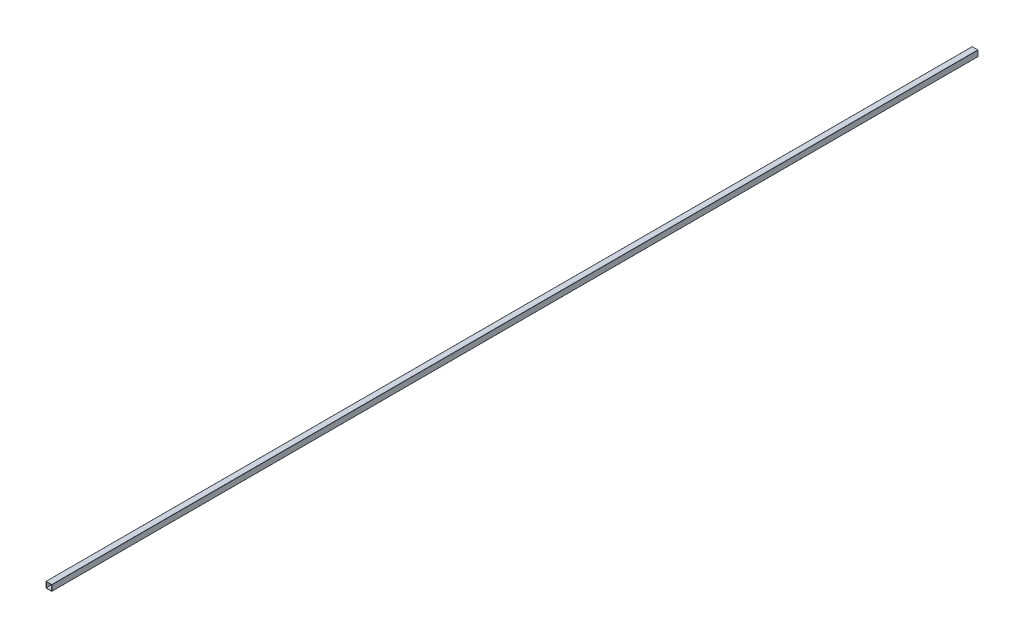
ISO-10303-21;
HEADER;
FILE_DESCRIPTION(('STEP AP214'),'2;1');
FILE_NAME('part.step','',(''),(''),'','','');
FILE_SCHEMA(('AUTOMOTIVE_DESIGN { 1 0 10303 214 1 1 1 1 }'));
ENDSEC;
DATA;
#1=APPLICATION_CONTEXT('core data for automotive mechanical design processes');
#2=APPLICATION_PROTOCOL_DEFINITION('international standard','automotive_design',2000,#1);
#3=PRODUCT_CONTEXT('',#1,'mechanical');
#4=PRODUCT('Part','Part','',(#3));
#5=PRODUCT_RELATED_PRODUCT_CATEGORY('part','',(#4));
#6=PRODUCT_DEFINITION_FORMATION('','',#4);
#7=PRODUCT_DEFINITION_CONTEXT('part definition',#1,'design');
#8=PRODUCT_DEFINITION('design','',#6,#7);
#9=PRODUCT_DEFINITION_SHAPE('','',#8);
#10=(LENGTH_UNIT() NAMED_UNIT(*) SI_UNIT(.MILLI.,.METRE.));
#11=(NAMED_UNIT(*) PLANE_ANGLE_UNIT() SI_UNIT($,.RADIAN.));
#12=(NAMED_UNIT(*) SI_UNIT($,.STERADIAN.) SOLID_ANGLE_UNIT());
#13=UNCERTAINTY_MEASURE_WITH_UNIT(LENGTH_MEASURE(1.E-05),#10,'distance_accuracy_value','');
#14=(GEOMETRIC_REPRESENTATION_CONTEXT(3) GLOBAL_UNCERTAINTY_ASSIGNED_CONTEXT((#13)) GLOBAL_UNIT_ASSIGNED_CONTEXT((#10,
#11,#12)) REPRESENTATION_CONTEXT('',''));
#15=CARTESIAN_POINT('',(0.,0.,0.));
#16=DIRECTION('',(0.,0.,1.));
#17=DIRECTION('',(1.,0.,0.));
#18=AXIS2_PLACEMENT_3D('',#15,#16,#17);
#19=CARTESIAN_POINT('',(18.05,18.05,6000.));
#20=DIRECTION('',(0.,0.,-1.));
#21=DIRECTION('',(-1.,0.,0.));
#22=AXIS2_PLACEMENT_3D('',#19,#20,#21);
#23=PLANE('',#22);
#24=CARTESIAN_POINT('',(18.05,18.05,6000.));
#25=DIRECTION('',(0.,0.,1.));
#26=DIRECTION('',(-1.,0.,0.));
#27=AXIS2_PLACEMENT_3D('',#24,#25,#26);
#28=CIRCLE('',#27,1.);
#29=CARTESIAN_POINT('',(19.05,18.05,6000.));
#30=VERTEX_POINT('',#29);
#31=CARTESIAN_POINT('',(18.05,19.05,6000.));
#32=VERTEX_POINT('',#31);
#33=EDGE_CURVE('E158',#30,#32,#28,.T.);
#34=ORIENTED_EDGE('',*,*,#33,.T.);
#35=DIRECTION('',(-1.,0.,0.));
#36=VECTOR('',#35,1.);
#37=CARTESIAN_POINT('',(-18.05,19.05,6000.));
#38=LINE('',#37,#36);
#39=CARTESIAN_POINT('',(-18.05,19.05,6000.));
#40=VERTEX_POINT('',#39);
#41=EDGE_CURVE('E161',#32,#40,#38,.T.);
#42=ORIENTED_EDGE('',*,*,#41,.T.);
#43=CARTESIAN_POINT('',(-18.05,18.05,6000.));
#44=DIRECTION('',(0.,0.,1.));
#45=DIRECTION('',(-1.,0.,0.));
#46=AXIS2_PLACEMENT_3D('',#43,#44,#45);
#47=CIRCLE('',#46,1.);
#48=CARTESIAN_POINT('',(-19.05,18.05,6000.));
#49=VERTEX_POINT('',#48);
#50=EDGE_CURVE('E164',#40,#49,#47,.T.);
#51=ORIENTED_EDGE('',*,*,#50,.T.);
#52=DIRECTION('',(0.,-1.,0.));
#53=VECTOR('',#52,1.);
#54=CARTESIAN_POINT('',(-19.05,-18.05,6000.));
#55=LINE('',#54,#53);
#56=CARTESIAN_POINT('',(-19.05,-18.05,6000.));
#57=VERTEX_POINT('',#56);
#58=EDGE_CURVE('E166',#49,#57,#55,.T.);
#59=ORIENTED_EDGE('',*,*,#58,.T.);
#60=CARTESIAN_POINT('',(-18.05,-18.05,6000.));
#61=DIRECTION('',(0.,0.,1.));
#62=DIRECTION('',(-1.,0.,0.));
#63=AXIS2_PLACEMENT_3D('',#60,#61,#62);
#64=CIRCLE('',#63,1.);
#65=CARTESIAN_POINT('',(-18.05,-19.05,6000.));
#66=VERTEX_POINT('',#65);
#67=EDGE_CURVE('E168',#57,#66,#64,.T.);
#68=ORIENTED_EDGE('',*,*,#67,.T.);
#69=DIRECTION('',(1.,0.,0.));
#70=VECTOR('',#69,1.);
#71=CARTESIAN_POINT('',(-18.05,-19.05,6000.));
#72=LINE('',#71,#70);
#73=CARTESIAN_POINT('',(18.05,-19.05,6000.));
#74=VERTEX_POINT('',#73);
#75=EDGE_CURVE('E170',#66,#74,#72,.T.);
#76=ORIENTED_EDGE('',*,*,#75,.T.);
#77=CARTESIAN_POINT('',(18.05,-18.05,6000.));
#78=DIRECTION('',(0.,0.,1.));
#79=DIRECTION('',(1.,0.,0.));
#80=AXIS2_PLACEMENT_3D('',#77,#78,#79);
#81=CIRCLE('',#80,1.);
#82=CARTESIAN_POINT('',(19.05,-18.05,6000.));
#83=VERTEX_POINT('',#82);
#84=EDGE_CURVE('E172',#74,#83,#81,.T.);
#85=ORIENTED_EDGE('',*,*,#84,.T.);
#86=DIRECTION('',(0.,1.,0.));
#87=VECTOR('',#86,1.);
#88=CARTESIAN_POINT('',(19.05,-18.05,6000.));
#89=LINE('',#88,#87);
#90=EDGE_CURVE('E174',#83,#30,#89,.T.);
#91=ORIENTED_EDGE('',*,*,#90,.T.);
#92=EDGE_LOOP('',(#34,#42,#51,#59,#68,#76,#85,#91));
#93=FACE_BOUND('',#92,.T.);
#94=DIRECTION('',(1.,0.,0.));
#95=VECTOR('',#94,1.);
#96=CARTESIAN_POINT('',(-17.16,-17.16,6000.));
#97=LINE('',#96,#95);
#98=CARTESIAN_POINT('',(-17.16,-17.16,6000.));
#99=VERTEX_POINT('',#98);
#100=CARTESIAN_POINT('',(17.16,-17.16,6000.));
#101=VERTEX_POINT('',#100);
#102=EDGE_CURVE('E122',#99,#101,#97,.T.);
#103=ORIENTED_EDGE('',*,*,#102,.F.);
#104=DIRECTION('',(0.,-1.,0.));
#105=VECTOR('',#104,1.);
#106=CARTESIAN_POINT('',(-17.16,-17.16,6000.));
#107=LINE('',#106,#105);
#108=CARTESIAN_POINT('',(-17.16,17.16,6000.));
#109=VERTEX_POINT('',#108);
#110=EDGE_CURVE('E144',#109,#99,#107,.T.);
#111=ORIENTED_EDGE('',*,*,#110,.F.);
#112=DIRECTION('',(-1.,0.,0.));
#113=VECTOR('',#112,1.);
#114=CARTESIAN_POINT('',(-17.16,17.16,6000.));
#115=LINE('',#114,#113);
#116=CARTESIAN_POINT('',(17.16,17.16,6000.));
#117=VERTEX_POINT('',#116);
#118=EDGE_CURVE('E142',#117,#109,#115,.T.);
#119=ORIENTED_EDGE('',*,*,#118,.F.);
#120=DIRECTION('',(0.,1.,0.));
#121=VECTOR('',#120,1.);
#122=CARTESIAN_POINT('',(17.16,-17.16,6000.));
#123=LINE('',#122,#121);
#124=EDGE_CURVE('E130',#101,#117,#123,.T.);
#125=ORIENTED_EDGE('',*,*,#124,.F.);
#126=EDGE_LOOP('',(#103,#111,#119,#125));
#127=FACE_BOUND('',#126,.T.);
#128=ADVANCED_FACE('F33',(#93,#127),#23,.F.);
#129=CARTESIAN_POINT('',(18.05,18.05,0.));
#130=DIRECTION('',(0.,0.,-1.));
#131=DIRECTION('',(-1.,0.,0.));
#132=AXIS2_PLACEMENT_3D('',#129,#130,#131);
#133=PLANE('',#132);
#134=CARTESIAN_POINT('',(18.05,18.05,0.));
#135=DIRECTION('',(0.,0.,1.));
#136=DIRECTION('',(-1.,0.,0.));
#137=AXIS2_PLACEMENT_3D('',#134,#135,#136);
#138=CIRCLE('',#137,1.);
#139=CARTESIAN_POINT('',(19.05,18.05,0.));
#140=VERTEX_POINT('',#139);
#141=CARTESIAN_POINT('',(18.05,19.05,0.));
#142=VERTEX_POINT('',#141);
#143=EDGE_CURVE('E138',#140,#142,#138,.T.);
#144=ORIENTED_EDGE('',*,*,#143,.F.);
#145=DIRECTION('',(0.,1.,0.));
#146=VECTOR('',#145,1.);
#147=CARTESIAN_POINT('',(19.05,-18.05,0.));
#148=LINE('',#147,#146);
#149=CARTESIAN_POINT('',(19.05,-18.05,0.));
#150=VERTEX_POINT('',#149);
#151=EDGE_CURVE('E162',#150,#140,#148,.T.);
#152=ORIENTED_EDGE('',*,*,#151,.F.);
#153=CARTESIAN_POINT('',(18.05,-18.05,0.));
#154=DIRECTION('',(0.,0.,1.));
#155=DIRECTION('',(1.,0.,0.));
#156=AXIS2_PLACEMENT_3D('',#153,#154,#155);
#157=CIRCLE('',#156,1.);
#158=CARTESIAN_POINT('',(18.05,-19.05,0.));
#159=VERTEX_POINT('',#158);
#160=EDGE_CURVE('E189',#159,#150,#157,.T.);
#161=ORIENTED_EDGE('',*,*,#160,.F.);
#162=DIRECTION('',(1.,0.,0.));
#163=VECTOR('',#162,1.);
#164=CARTESIAN_POINT('',(-18.05,-19.05,0.));
#165=LINE('',#164,#163);
#166=CARTESIAN_POINT('',(-18.05,-19.05,0.));
#167=VERTEX_POINT('',#166);
#168=EDGE_CURVE('E187',#167,#159,#165,.T.);
#169=ORIENTED_EDGE('',*,*,#168,.F.);
#170=CARTESIAN_POINT('',(-18.05,-18.05,0.));
#171=DIRECTION('',(0.,0.,1.));
#172=DIRECTION('',(-1.,0.,0.));
#173=AXIS2_PLACEMENT_3D('',#170,#171,#172);
#174=CIRCLE('',#173,1.);
#175=CARTESIAN_POINT('',(-19.05,-18.05,0.));
#176=VERTEX_POINT('',#175);
#177=EDGE_CURVE('E185',#176,#167,#174,.T.);
#178=ORIENTED_EDGE('',*,*,#177,.F.);
#179=DIRECTION('',(0.,-1.,0.));
#180=VECTOR('',#179,1.);
#181=CARTESIAN_POINT('',(-19.05,-18.05,0.));
#182=LINE('',#181,#180);
#183=CARTESIAN_POINT('',(-19.05,18.05,0.));
#184=VERTEX_POINT('',#183);
#185=EDGE_CURVE('E183',#184,#176,#182,.T.);
#186=ORIENTED_EDGE('',*,*,#185,.F.);
#187=CARTESIAN_POINT('',(-18.05,18.05,0.));
#188=DIRECTION('',(0.,0.,1.));
#189=DIRECTION('',(-1.,0.,0.));
#190=AXIS2_PLACEMENT_3D('',#187,#188,#189);
#191=CIRCLE('',#190,1.);
#192=CARTESIAN_POINT('',(-18.05,19.05,0.));
#193=VERTEX_POINT('',#192);
#194=EDGE_CURVE('E181',#193,#184,#191,.T.);
#195=ORIENTED_EDGE('',*,*,#194,.F.);
#196=DIRECTION('',(-1.,0.,0.));
#197=VECTOR('',#196,1.);
#198=CARTESIAN_POINT('',(-18.05,19.05,0.));
#199=LINE('',#198,#197);
#200=EDGE_CURVE('E179',#142,#193,#199,.T.);
#201=ORIENTED_EDGE('',*,*,#200,.F.);
#202=EDGE_LOOP('',(#144,#152,#161,#169,#178,#186,#195,#201));
#203=FACE_BOUND('',#202,.T.);
#204=DIRECTION('',(0.,-1.,0.));
#205=VECTOR('',#204,1.);
#206=CARTESIAN_POINT('',(-17.16,-17.16,0.));
#207=LINE('',#206,#205);
#208=CARTESIAN_POINT('',(-17.16,17.16,0.));
#209=VERTEX_POINT('',#208);
#210=CARTESIAN_POINT('',(-17.16,-17.16,0.));
#211=VERTEX_POINT('',#210);
#212=EDGE_CURVE('E131',#209,#211,#207,.T.);
#213=ORIENTED_EDGE('',*,*,#212,.T.);
#214=DIRECTION('',(1.,0.,0.));
#215=VECTOR('',#214,1.);
#216=CARTESIAN_POINT('',(-17.16,-17.16,0.));
#217=LINE('',#216,#215);
#218=CARTESIAN_POINT('',(17.16,-17.16,0.));
#219=VERTEX_POINT('',#218);
#220=EDGE_CURVE('E56',#211,#219,#217,.T.);
#221=ORIENTED_EDGE('',*,*,#220,.T.);
#222=DIRECTION('',(0.,1.,0.));
#223=VECTOR('',#222,1.);
#224=CARTESIAN_POINT('',(17.16,-17.16,0.));
#225=LINE('',#224,#223);
#226=CARTESIAN_POINT('',(17.16,17.16,0.));
#227=VERTEX_POINT('',#226);
#228=EDGE_CURVE('E137',#219,#227,#225,.T.);
#229=ORIENTED_EDGE('',*,*,#228,.T.);
#230=DIRECTION('',(-1.,0.,0.));
#231=VECTOR('',#230,1.);
#232=CARTESIAN_POINT('',(-17.16,17.16,0.));
#233=LINE('',#232,#231);
#234=EDGE_CURVE('E150',#227,#209,#233,.T.);
#235=ORIENTED_EDGE('',*,*,#234,.T.);
#236=EDGE_LOOP('',(#213,#221,#229,#235));
#237=FACE_BOUND('',#236,.T.);
#238=ADVANCED_FACE('F219',(#203,#237),#133,.T.);
#239=CARTESIAN_POINT('',(18.05,18.05,6000.));
#240=DIRECTION('',(0.,0.,-1.));
#241=DIRECTION('',(-1.,0.,0.));
#242=AXIS2_PLACEMENT_3D('',#239,#240,#241);
#243=CYLINDRICAL_SURFACE('',#242,1.);
#244=ORIENTED_EDGE('',*,*,#143,.T.);
#245=DIRECTION('',(0.,0.,-1.));
#246=VECTOR('',#245,1.);
#247=CARTESIAN_POINT('',(18.05,19.05,6000.));
#248=LINE('',#247,#246);
#249=EDGE_CURVE('E11',#32,#142,#248,.T.);
#250=ORIENTED_EDGE('',*,*,#249,.F.);
#251=ORIENTED_EDGE('',*,*,#33,.F.);
#252=DIRECTION('',(0.,0.,-1.));
#253=VECTOR('',#252,1.);
#254=CARTESIAN_POINT('',(19.05,18.05,6000.));
#255=LINE('',#254,#253);
#256=EDGE_CURVE('E176',#30,#140,#255,.T.);
#257=ORIENTED_EDGE('',*,*,#256,.T.);
#258=EDGE_LOOP('',(#244,#250,#251,#257));
#259=FACE_BOUND('',#258,.T.);
#260=ADVANCED_FACE('F35',(#259),#243,.T.);
#261=CARTESIAN_POINT('',(-18.05,19.05,6000.));
#262=DIRECTION('',(0.,-1.,0.));
#263=DIRECTION('',(0.,0.,-1.));
#264=AXIS2_PLACEMENT_3D('',#261,#262,#263);
#265=PLANE('',#264);
#266=ORIENTED_EDGE('',*,*,#200,.T.);
#267=DIRECTION('',(0.,0.,-1.));
#268=VECTOR('',#267,1.);
#269=CARTESIAN_POINT('',(-18.05,19.05,6000.));
#270=LINE('',#269,#268);
#271=EDGE_CURVE('E41',#40,#193,#270,.T.);
#272=ORIENTED_EDGE('',*,*,#271,.F.);
#273=ORIENTED_EDGE('',*,*,#41,.F.);
#274=ORIENTED_EDGE('',*,*,#249,.T.);
#275=EDGE_LOOP('',(#266,#272,#273,#274));
#276=FACE_BOUND('',#275,.T.);
#277=ADVANCED_FACE('F236',(#276),#265,.F.);
#278=CARTESIAN_POINT('',(-18.05,18.05,6000.));
#279=DIRECTION('',(0.,0.,-1.));
#280=DIRECTION('',(-1.,0.,0.));
#281=AXIS2_PLACEMENT_3D('',#278,#279,#280);
#282=CYLINDRICAL_SURFACE('',#281,1.);
#283=ORIENTED_EDGE('',*,*,#194,.T.);
#284=DIRECTION('',(0.,0.,-1.));
#285=VECTOR('',#284,1.);
#286=CARTESIAN_POINT('',(-19.05,18.05,6000.));
#287=LINE('',#286,#285);
#288=EDGE_CURVE('E206',#49,#184,#287,.T.);
#289=ORIENTED_EDGE('',*,*,#288,.F.);
#290=ORIENTED_EDGE('',*,*,#50,.F.);
#291=ORIENTED_EDGE('',*,*,#271,.T.);
#292=EDGE_LOOP('',(#283,#289,#290,#291));
#293=FACE_BOUND('',#292,.T.);
#294=ADVANCED_FACE('F213',(#293),#282,.T.);
#295=CARTESIAN_POINT('',(-19.05,-18.05,6000.));
#296=DIRECTION('',(1.,0.,0.));
#297=DIRECTION('',(0.,0.,-1.));
#298=AXIS2_PLACEMENT_3D('',#295,#296,#297);
#299=PLANE('',#298);
#300=ORIENTED_EDGE('',*,*,#185,.T.);
#301=DIRECTION('',(0.,0.,-1.));
#302=VECTOR('',#301,1.);
#303=CARTESIAN_POINT('',(-19.05,-18.05,6000.));
#304=LINE('',#303,#302);
#305=EDGE_CURVE('E203',#57,#176,#304,.T.);
#306=ORIENTED_EDGE('',*,*,#305,.F.);
#307=ORIENTED_EDGE('',*,*,#58,.F.);
#308=ORIENTED_EDGE('',*,*,#288,.T.);
#309=EDGE_LOOP('',(#300,#306,#307,#308));
#310=FACE_BOUND('',#309,.T.);
#311=ADVANCED_FACE('F225',(#310),#299,.F.);
#312=CARTESIAN_POINT('',(-18.05,-18.05,6000.));
#313=DIRECTION('',(0.,0.,-1.));
#314=DIRECTION('',(-1.,0.,0.));
#315=AXIS2_PLACEMENT_3D('',#312,#313,#314);
#316=CYLINDRICAL_SURFACE('',#315,1.);
#317=ORIENTED_EDGE('',*,*,#177,.T.);
#318=DIRECTION('',(0.,0.,-1.));
#319=VECTOR('',#318,1.);
#320=CARTESIAN_POINT('',(-18.05,-19.05,6000.));
#321=LINE('',#320,#319);
#322=EDGE_CURVE('E200',#66,#167,#321,.T.);
#323=ORIENTED_EDGE('',*,*,#322,.F.);
#324=ORIENTED_EDGE('',*,*,#67,.F.);
#325=ORIENTED_EDGE('',*,*,#305,.T.);
#326=EDGE_LOOP('',(#317,#323,#324,#325));
#327=FACE_BOUND('',#326,.T.);
#328=ADVANCED_FACE('F229',(#327),#316,.T.);
#329=CARTESIAN_POINT('',(-18.05,-19.05,6000.));
#330=DIRECTION('',(0.,1.,0.));
#331=DIRECTION('',(0.,0.,1.));
#332=AXIS2_PLACEMENT_3D('',#329,#330,#331);
#333=PLANE('',#332);
#334=ORIENTED_EDGE('',*,*,#168,.T.);
#335=DIRECTION('',(0.,0.,-1.));
#336=VECTOR('',#335,1.);
#337=CARTESIAN_POINT('',(18.05,-19.05,6000.));
#338=LINE('',#337,#336);
#339=EDGE_CURVE('E197',#74,#159,#338,.T.);
#340=ORIENTED_EDGE('',*,*,#339,.F.);
#341=ORIENTED_EDGE('',*,*,#75,.F.);
#342=ORIENTED_EDGE('',*,*,#322,.T.);
#343=EDGE_LOOP('',(#334,#340,#341,#342));
#344=FACE_BOUND('',#343,.T.);
#345=ADVANCED_FACE('F249',(#344),#333,.F.);
#346=CARTESIAN_POINT('',(18.05,-18.05,6000.));
#347=DIRECTION('',(0.,0.,-1.));
#348=DIRECTION('',(-1.,0.,0.));
#349=AXIS2_PLACEMENT_3D('',#346,#347,#348);
#350=CYLINDRICAL_SURFACE('',#349,1.);
#351=ORIENTED_EDGE('',*,*,#160,.T.);
#352=DIRECTION('',(0.,0.,-1.));
#353=VECTOR('',#352,1.);
#354=CARTESIAN_POINT('',(19.05,-18.05,6000.));
#355=LINE('',#354,#353);
#356=EDGE_CURVE('E194',#83,#150,#355,.T.);
#357=ORIENTED_EDGE('',*,*,#356,.F.);
#358=ORIENTED_EDGE('',*,*,#84,.F.);
#359=ORIENTED_EDGE('',*,*,#339,.T.);
#360=EDGE_LOOP('',(#351,#357,#358,#359));
#361=FACE_BOUND('',#360,.T.);
#362=ADVANCED_FACE('F247',(#361),#350,.T.);
#363=CARTESIAN_POINT('',(19.05,-18.05,6000.));
#364=DIRECTION('',(-1.,0.,0.));
#365=DIRECTION('',(0.,0.,1.));
#366=AXIS2_PLACEMENT_3D('',#363,#364,#365);
#367=PLANE('',#366);
#368=ORIENTED_EDGE('',*,*,#151,.T.);
#369=ORIENTED_EDGE('',*,*,#256,.F.);
#370=ORIENTED_EDGE('',*,*,#90,.F.);
#371=ORIENTED_EDGE('',*,*,#356,.T.);
#372=EDGE_LOOP('',(#368,#369,#370,#371));
#373=FACE_BOUND('',#372,.T.);
#374=ADVANCED_FACE('F242',(#373),#367,.F.);
#375=CARTESIAN_POINT('',(-17.16,-17.16,6000.));
#376=DIRECTION('',(0.,1.,0.));
#377=DIRECTION('',(0.,0.,1.));
#378=AXIS2_PLACEMENT_3D('',#375,#376,#377);
#379=PLANE('',#378);
#380=ORIENTED_EDGE('',*,*,#220,.F.);
#381=DIRECTION('',(0.,0.,-1.));
#382=VECTOR('',#381,1.);
#383=CARTESIAN_POINT('',(-17.16,-17.16,6000.));
#384=LINE('',#383,#382);
#385=EDGE_CURVE('E126',#99,#211,#384,.T.);
#386=ORIENTED_EDGE('',*,*,#385,.F.);
#387=ORIENTED_EDGE('',*,*,#102,.T.);
#388=DIRECTION('',(0.,0.,-1.));
#389=VECTOR('',#388,1.);
#390=CARTESIAN_POINT('',(17.16,-17.16,6000.));
#391=LINE('',#390,#389);
#392=EDGE_CURVE('E125',#101,#219,#391,.T.);
#393=ORIENTED_EDGE('',*,*,#392,.T.);
#394=EDGE_LOOP('',(#380,#386,#387,#393));
#395=FACE_BOUND('',#394,.T.);
#396=ADVANCED_FACE('F124',(#395),#379,.T.);
#397=CARTESIAN_POINT('',(17.16,-17.16,6000.));
#398=DIRECTION('',(-1.,0.,0.));
#399=DIRECTION('',(0.,0.,1.));
#400=AXIS2_PLACEMENT_3D('',#397,#398,#399);
#401=PLANE('',#400);
#402=ORIENTED_EDGE('',*,*,#228,.F.);
#403=ORIENTED_EDGE('',*,*,#392,.F.);
#404=ORIENTED_EDGE('',*,*,#124,.T.);
#405=DIRECTION('',(0.,0.,-1.));
#406=VECTOR('',#405,1.);
#407=CARTESIAN_POINT('',(17.16,17.16,6000.));
#408=LINE('',#407,#406);
#409=EDGE_CURVE('E139',#117,#227,#408,.T.);
#410=ORIENTED_EDGE('',*,*,#409,.T.);
#411=EDGE_LOOP('',(#402,#403,#404,#410));
#412=FACE_BOUND('',#411,.T.);
#413=ADVANCED_FACE('F134',(#412),#401,.T.);
#414=CARTESIAN_POINT('',(-17.16,17.16,6000.));
#415=DIRECTION('',(0.,-1.,0.));
#416=DIRECTION('',(0.,0.,-1.));
#417=AXIS2_PLACEMENT_3D('',#414,#415,#416);
#418=PLANE('',#417);
#419=ORIENTED_EDGE('',*,*,#234,.F.);
#420=ORIENTED_EDGE('',*,*,#409,.F.);
#421=ORIENTED_EDGE('',*,*,#118,.T.);
#422=DIRECTION('',(0.,0.,-1.));
#423=VECTOR('',#422,1.);
#424=CARTESIAN_POINT('',(-17.16,17.16,6000.));
#425=LINE('',#424,#423);
#426=EDGE_CURVE('E48',#109,#209,#425,.T.);
#427=ORIENTED_EDGE('',*,*,#426,.T.);
#428=EDGE_LOOP('',(#419,#420,#421,#427));
#429=FACE_BOUND('',#428,.T.);
#430=ADVANCED_FACE('F274',(#429),#418,.T.);
#431=CARTESIAN_POINT('',(-17.16,-17.16,6000.));
#432=DIRECTION('',(1.,0.,0.));
#433=DIRECTION('',(0.,0.,-1.));
#434=AXIS2_PLACEMENT_3D('',#431,#432,#433);
#435=PLANE('',#434);
#436=ORIENTED_EDGE('',*,*,#212,.F.);
#437=ORIENTED_EDGE('',*,*,#426,.F.);
#438=ORIENTED_EDGE('',*,*,#110,.T.);
#439=ORIENTED_EDGE('',*,*,#385,.T.);
#440=EDGE_LOOP('',(#436,#437,#438,#439));
#441=FACE_BOUND('',#440,.T.);
#442=ADVANCED_FACE('F278',(#441),#435,.T.);
#443=CLOSED_SHELL('',(#128,#238,#260,#277,#294,#311,#328,#345,#362,#374,#396,#413,#430,#442));
#444=MANIFOLD_SOLID_BREP('B2',#443);
#445=ADVANCED_BREP_SHAPE_REPRESENTATION('',(#18,#444),#14);
#446=SHAPE_DEFINITION_REPRESENTATION(#9,#445);
ENDSEC;
END-ISO-10303-21;
